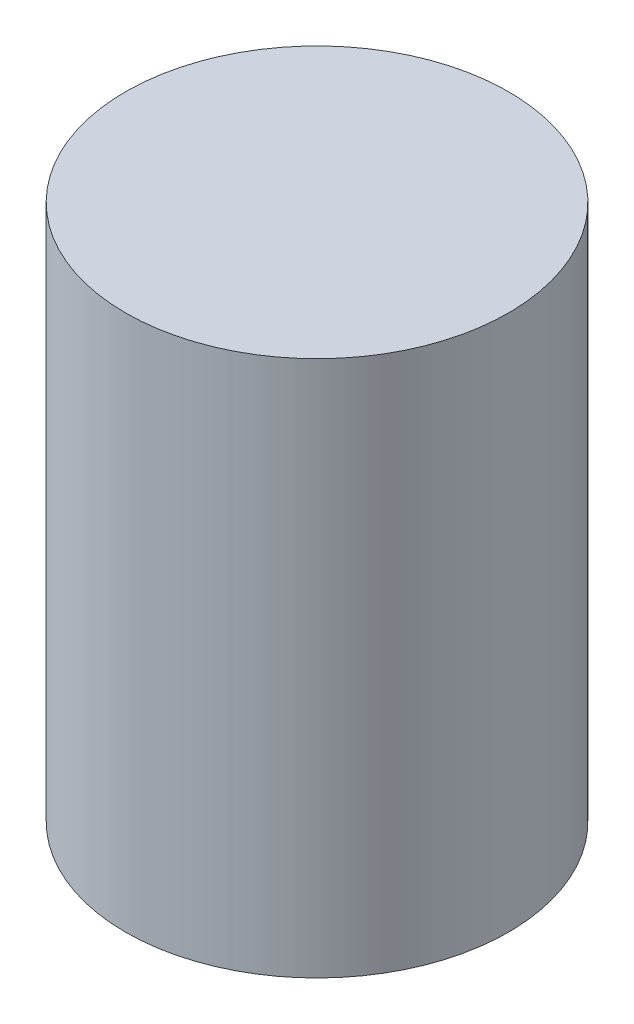
ISO-10303-21;
HEADER;
FILE_DESCRIPTION(('STEP AP214'),'2;1');
FILE_NAME('part.step','',(''),(''),'','','');
FILE_SCHEMA(('AUTOMOTIVE_DESIGN { 1 0 10303 214 1 1 1 1 }'));
ENDSEC;
DATA;
#1=APPLICATION_CONTEXT('core data for automotive mechanical design processes');
#2=APPLICATION_PROTOCOL_DEFINITION('international standard','automotive_design',2000,#1);
#3=PRODUCT_CONTEXT('',#1,'mechanical');
#4=PRODUCT('Part','Part','',(#3));
#5=PRODUCT_RELATED_PRODUCT_CATEGORY('part','',(#4));
#6=PRODUCT_DEFINITION_FORMATION('','',#4);
#7=PRODUCT_DEFINITION_CONTEXT('part definition',#1,'design');
#8=PRODUCT_DEFINITION('design','',#6,#7);
#9=PRODUCT_DEFINITION_SHAPE('','',#8);
#10=(LENGTH_UNIT() NAMED_UNIT(*) SI_UNIT(.MILLI.,.METRE.));
#11=(NAMED_UNIT(*) PLANE_ANGLE_UNIT() SI_UNIT($,.RADIAN.));
#12=(NAMED_UNIT(*) SI_UNIT($,.STERADIAN.) SOLID_ANGLE_UNIT());
#13=UNCERTAINTY_MEASURE_WITH_UNIT(LENGTH_MEASURE(1.E-05),#10,'distance_accuracy_value','');
#14=(GEOMETRIC_REPRESENTATION_CONTEXT(3) GLOBAL_UNCERTAINTY_ASSIGNED_CONTEXT((#13)) GLOBAL_UNIT_ASSIGNED_CONTEXT((#10,
#11,#12)) REPRESENTATION_CONTEXT('',''));
#15=CARTESIAN_POINT('',(0.,0.,0.));
#16=DIRECTION('',(0.,0.,1.));
#17=DIRECTION('',(1.,0.,0.));
#18=AXIS2_PLACEMENT_3D('',#15,#16,#17);
#19=CARTESIAN_POINT('',(0.,70.,0.));
#20=DIRECTION('',(0.,-1.,0.));
#21=DIRECTION('',(0.,0.,-1.));
#22=AXIS2_PLACEMENT_3D('',#19,#20,#21);
#23=CYLINDRICAL_SURFACE('',#22,25.);
#24=CARTESIAN_POINT('',(0.,70.,0.));
#25=DIRECTION('',(0.,1.,0.));
#26=DIRECTION('',(0.,0.,1.));
#27=AXIS2_PLACEMENT_3D('',#24,#25,#26);
#28=CIRCLE('',#27,25.);
#29=CARTESIAN_POINT('',(0.,70.,25.));
#30=VERTEX_POINT('',#29);
#31=EDGE_CURVE('E10',#30,#30,#28,.T.);
#32=ORIENTED_EDGE('',*,*,#31,.F.);
#33=EDGE_LOOP('',(#32));
#34=FACE_BOUND('',#33,.T.);
#35=CARTESIAN_POINT('',(0.,0.,0.));
#36=DIRECTION('',(0.,1.,0.));
#37=DIRECTION('',(0.,0.,1.));
#38=AXIS2_PLACEMENT_3D('',#35,#36,#37);
#39=CIRCLE('',#38,25.);
#40=CARTESIAN_POINT('',(0.,0.,25.));
#41=VERTEX_POINT('',#40);
#42=EDGE_CURVE('E41',#41,#41,#39,.T.);
#43=ORIENTED_EDGE('',*,*,#42,.T.);
#44=EDGE_LOOP('',(#43));
#45=FACE_BOUND('',#44,.T.);
#46=ADVANCED_FACE('F38',(#34,#45),#23,.T.);
#47=CARTESIAN_POINT('',(0.,70.,0.));
#48=DIRECTION('',(0.,1.,0.));
#49=DIRECTION('',(0.,0.,1.));
#50=AXIS2_PLACEMENT_3D('',#47,#48,#49);
#51=PLANE('',#50);
#52=ORIENTED_EDGE('',*,*,#31,.T.);
#53=EDGE_LOOP('',(#52));
#54=FACE_BOUND('',#53,.T.);
#55=ADVANCED_FACE('F53',(#54),#51,.T.);
#56=CARTESIAN_POINT('',(0.,0.,0.));
#57=DIRECTION('',(0.,1.,0.));
#58=DIRECTION('',(0.,0.,1.));
#59=AXIS2_PLACEMENT_3D('',#56,#57,#58);
#60=PLANE('',#59);
#61=ORIENTED_EDGE('',*,*,#42,.F.);
#62=EDGE_LOOP('',(#61));
#63=FACE_BOUND('',#62,.T.);
#64=ADVANCED_FACE('F51',(#63),#60,.F.);
#65=CLOSED_SHELL('',(#46,#55,#64));
#66=MANIFOLD_SOLID_BREP('B2',#65);
#67=ADVANCED_BREP_SHAPE_REPRESENTATION('',(#18,#66),#14);
#68=SHAPE_DEFINITION_REPRESENTATION(#9,#67);
ENDSEC;
END-ISO-10303-21;
